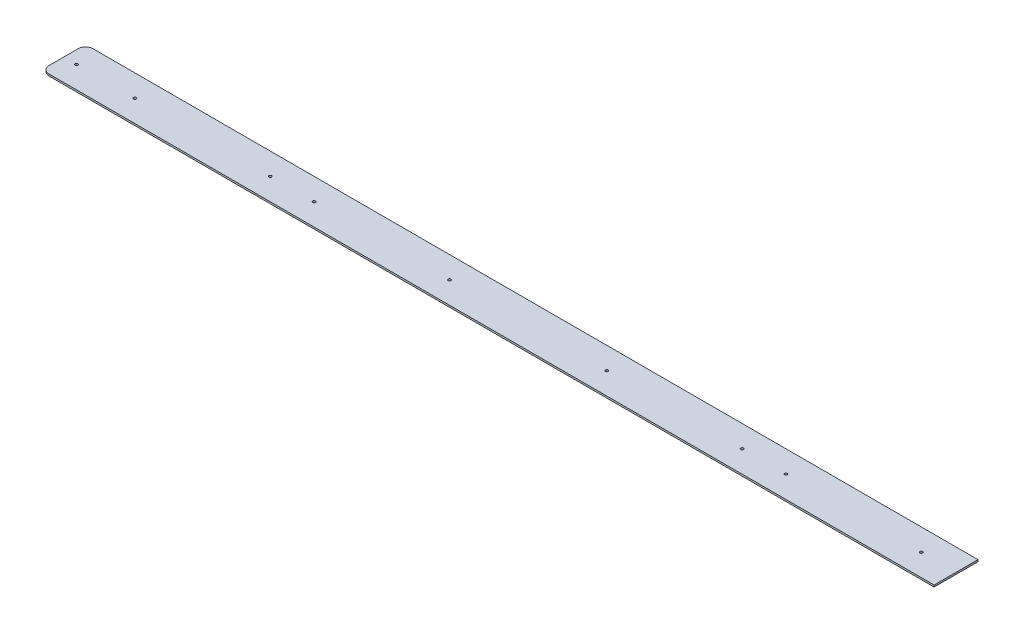
ISO-10303-21;
HEADER;
FILE_DESCRIPTION(('STEP AP214'),'2;1');
FILE_NAME('part.step','',(''),(''),'','','');
FILE_SCHEMA(('AUTOMOTIVE_DESIGN { 1 0 10303 214 1 1 1 1 }'));
ENDSEC;
DATA;
#1=APPLICATION_CONTEXT('core data for automotive mechanical design processes');
#2=APPLICATION_PROTOCOL_DEFINITION('international standard','automotive_design',2000,#1);
#3=PRODUCT_CONTEXT('',#1,'mechanical');
#4=PRODUCT('Part','Part','',(#3));
#5=PRODUCT_RELATED_PRODUCT_CATEGORY('part','',(#4));
#6=PRODUCT_DEFINITION_FORMATION('','',#4);
#7=PRODUCT_DEFINITION_CONTEXT('part definition',#1,'design');
#8=PRODUCT_DEFINITION('design','',#6,#7);
#9=PRODUCT_DEFINITION_SHAPE('','',#8);
#10=(LENGTH_UNIT() NAMED_UNIT(*) SI_UNIT(.MILLI.,.METRE.));
#11=(NAMED_UNIT(*) PLANE_ANGLE_UNIT() SI_UNIT($,.RADIAN.));
#12=(NAMED_UNIT(*) SI_UNIT($,.STERADIAN.) SOLID_ANGLE_UNIT());
#13=UNCERTAINTY_MEASURE_WITH_UNIT(LENGTH_MEASURE(1.E-05),#10,'distance_accuracy_value','');
#14=(GEOMETRIC_REPRESENTATION_CONTEXT(3) GLOBAL_UNCERTAINTY_ASSIGNED_CONTEXT((#13)) GLOBAL_UNIT_ASSIGNED_CONTEXT((#10,
#11,#12)) REPRESENTATION_CONTEXT('',''));
#15=CARTESIAN_POINT('',(0.,0.,0.));
#16=DIRECTION('',(0.,0.,1.));
#17=DIRECTION('',(1.,0.,0.));
#18=AXIS2_PLACEMENT_3D('',#15,#16,#17);
#19=CARTESIAN_POINT('',(-1536.7,-3.17499999999998,38.1000000000001));
#20=DIRECTION('',(0.,0.,1.));
#21=DIRECTION('',(1.,0.,0.));
#22=AXIS2_PLACEMENT_3D('',#19,#20,#21);
#23=PLANE('',#22);
#24=DIRECTION('',(1.,0.,0.));
#25=VECTOR('',#24,1.);
#26=CARTESIAN_POINT('',(-1536.7,0.,38.1000000000002));
#27=LINE('',#26,#25);
#28=CARTESIAN_POINT('',(-1536.7,0.,38.1000000000001));
#29=VERTEX_POINT('',#28);
#30=CARTESIAN_POINT('',(1.11022302462516E-13,0.,38.1));
#31=VERTEX_POINT('',#30);
#32=EDGE_CURVE('E84',#29,#31,#27,.T.);
#33=ORIENTED_EDGE('',*,*,#32,.F.);
#34=DIRECTION('',(0.,1.,0.));
#35=VECTOR('',#34,1.);
#36=CARTESIAN_POINT('',(-1536.7,-3.17499999999998,38.1));
#37=LINE('',#36,#35);
#38=CARTESIAN_POINT('',(-1536.7,-3.17499999999998,38.1));
#39=VERTEX_POINT('',#38);
#40=EDGE_CURVE('E11',#39,#29,#37,.T.);
#41=ORIENTED_EDGE('',*,*,#40,.F.);
#42=DIRECTION('',(1.,0.,0.));
#43=VECTOR('',#42,1.);
#44=CARTESIAN_POINT('',(-1536.7,-3.17499999999998,38.1000000000001));
#45=LINE('',#44,#43);
#46=CARTESIAN_POINT('',(1.11022302462516E-13,-3.175,38.1));
#47=VERTEX_POINT('',#46);
#48=EDGE_CURVE('E86',#39,#47,#45,.T.);
#49=ORIENTED_EDGE('',*,*,#48,.T.);
#50=DIRECTION('',(0.,1.,0.));
#51=VECTOR('',#50,1.);
#52=CARTESIAN_POINT('',(1.11022302462516E-13,-3.175,38.1));
#53=LINE('',#52,#51);
#54=EDGE_CURVE('E35',#47,#31,#53,.T.);
#55=ORIENTED_EDGE('',*,*,#54,.T.);
#56=EDGE_LOOP('',(#33,#41,#49,#55));
#57=FACE_BOUND('',#56,.T.);
#58=ADVANCED_FACE('F32',(#57),#23,.T.);
#59=CARTESIAN_POINT('',(-1536.7,-3.17499999999998,25.4000000000002));
#60=DIRECTION('',(0.,1.,0.));
#61=DIRECTION('',(0.,0.,1.));
#62=AXIS2_PLACEMENT_3D('',#59,#60,#61);
#63=CYLINDRICAL_SURFACE('',#62,12.7);
#64=CARTESIAN_POINT('',(-1536.7,0.,25.4000000000002));
#65=DIRECTION('',(0.,1.,0.));
#66=DIRECTION('',(0.,0.,1.));
#67=AXIS2_PLACEMENT_3D('',#64,#65,#66);
#68=CIRCLE('',#67,12.7);
#69=CARTESIAN_POINT('',(-1549.4,0.,25.4000000000001));
#70=VERTEX_POINT('',#69);
#71=EDGE_CURVE('E102',#70,#29,#68,.T.);
#72=ORIENTED_EDGE('',*,*,#71,.F.);
#73=DIRECTION('',(0.,1.,0.));
#74=VECTOR('',#73,1.);
#75=CARTESIAN_POINT('',(-1549.4,-3.17499999999996,25.4000000000002));
#76=LINE('',#75,#74);
#77=CARTESIAN_POINT('',(-1549.4,-3.17499999999996,25.4000000000002));
#78=VERTEX_POINT('',#77);
#79=EDGE_CURVE('E40',#78,#70,#76,.T.);
#80=ORIENTED_EDGE('',*,*,#79,.F.);
#81=CARTESIAN_POINT('',(-1536.7,-3.17499999999998,25.4000000000002));
#82=DIRECTION('',(0.,1.,0.));
#83=DIRECTION('',(0.,0.,1.));
#84=AXIS2_PLACEMENT_3D('',#81,#82,#83);
#85=CIRCLE('',#84,12.7);
#86=EDGE_CURVE('E91',#78,#39,#85,.T.);
#87=ORIENTED_EDGE('',*,*,#86,.T.);
#88=ORIENTED_EDGE('',*,*,#40,.T.);
#89=EDGE_LOOP('',(#72,#80,#87,#88));
#90=FACE_BOUND('',#89,.T.);
#91=ADVANCED_FACE('F142',(#90),#63,.T.);
#92=CARTESIAN_POINT('',(-1549.4,-3.17499999999996,-25.4000000000001));
#93=DIRECTION('',(-1.,0.,0.));
#94=DIRECTION('',(0.,0.,1.));
#95=AXIS2_PLACEMENT_3D('',#92,#93,#94);
#96=PLANE('',#95);
#97=DIRECTION('',(0.,0.,1.));
#98=VECTOR('',#97,1.);
#99=CARTESIAN_POINT('',(-1549.4,0.,-25.4000000000002));
#100=LINE('',#99,#98);
#101=CARTESIAN_POINT('',(-1549.4,0.,-25.4000000000002));
#102=VERTEX_POINT('',#101);
#103=EDGE_CURVE('E114',#102,#70,#100,.T.);
#104=ORIENTED_EDGE('',*,*,#103,.F.);
#105=DIRECTION('',(0.,1.,0.));
#106=VECTOR('',#105,1.);
#107=CARTESIAN_POINT('',(-1549.4,-3.17499999999996,-25.4000000000001));
#108=LINE('',#107,#106);
#109=CARTESIAN_POINT('',(-1549.4,-3.17499999999996,-25.4000000000001));
#110=VERTEX_POINT('',#109);
#111=EDGE_CURVE('E130',#110,#102,#108,.T.);
#112=ORIENTED_EDGE('',*,*,#111,.F.);
#113=DIRECTION('',(0.,0.,1.));
#114=VECTOR('',#113,1.);
#115=CARTESIAN_POINT('',(-1549.4,-3.17499999999996,-25.4000000000001));
#116=LINE('',#115,#114);
#117=EDGE_CURVE('E126',#110,#78,#116,.T.);
#118=ORIENTED_EDGE('',*,*,#117,.T.);
#119=ORIENTED_EDGE('',*,*,#79,.T.);
#120=EDGE_LOOP('',(#104,#112,#118,#119));
#121=FACE_BOUND('',#120,.T.);
#122=ADVANCED_FACE('F147',(#121),#96,.T.);
#123=CARTESIAN_POINT('',(-1536.7,-3.17499999999996,-25.4000000000002));
#124=DIRECTION('',(0.,1.,0.));
#125=DIRECTION('',(0.,0.,1.));
#126=AXIS2_PLACEMENT_3D('',#123,#124,#125);
#127=CYLINDRICAL_SURFACE('',#126,12.7);
#128=CARTESIAN_POINT('',(-1536.7,0.,-25.4000000000002));
#129=DIRECTION('',(0.,1.,0.));
#130=DIRECTION('',(0.,0.,1.));
#131=AXIS2_PLACEMENT_3D('',#128,#129,#130);
#132=CIRCLE('',#131,12.7);
#133=CARTESIAN_POINT('',(-1536.7,0.,-38.1000000000001));
#134=VERTEX_POINT('',#133);
#135=EDGE_CURVE('E111',#134,#102,#132,.T.);
#136=ORIENTED_EDGE('',*,*,#135,.F.);
#137=DIRECTION('',(0.,1.,0.));
#138=VECTOR('',#137,1.);
#139=CARTESIAN_POINT('',(-1536.7,-3.17499999999996,-38.1000000000002));
#140=LINE('',#139,#138);
#141=CARTESIAN_POINT('',(-1536.7,-3.17499999999996,-38.1000000000002));
#142=VERTEX_POINT('',#141);
#143=EDGE_CURVE('E132',#142,#134,#140,.T.);
#144=ORIENTED_EDGE('',*,*,#143,.F.);
#145=CARTESIAN_POINT('',(-1536.7,-3.17499999999996,-25.4000000000002));
#146=DIRECTION('',(0.,1.,0.));
#147=DIRECTION('',(0.,0.,1.));
#148=AXIS2_PLACEMENT_3D('',#145,#146,#147);
#149=CIRCLE('',#148,12.7);
#150=EDGE_CURVE('E123',#142,#110,#149,.T.);
#151=ORIENTED_EDGE('',*,*,#150,.T.);
#152=ORIENTED_EDGE('',*,*,#111,.T.);
#153=EDGE_LOOP('',(#136,#144,#151,#152));
#154=FACE_BOUND('',#153,.T.);
#155=ADVANCED_FACE('F139',(#154),#127,.T.);
#156=CARTESIAN_POINT('',(1.11022302462516E-13,-3.17500000000001,-38.0999999999999));
#157=DIRECTION('',(0.,0.,-1.));
#158=DIRECTION('',(-1.,0.,0.));
#159=AXIS2_PLACEMENT_3D('',#156,#157,#158);
#160=PLANE('',#159);
#161=DIRECTION('',(-1.,0.,0.));
#162=VECTOR('',#161,1.);
#163=CARTESIAN_POINT('',(1.11022302462516E-13,0.,-38.1000000000001));
#164=LINE('',#163,#162);
#165=CARTESIAN_POINT('',(1.11022302462516E-13,0.,-38.1000000000001));
#166=VERTEX_POINT('',#165);
#167=EDGE_CURVE('E98',#166,#134,#164,.T.);
#168=ORIENTED_EDGE('',*,*,#167,.F.);
#169=DIRECTION('',(0.,1.,0.));
#170=VECTOR('',#169,1.);
#171=CARTESIAN_POINT('',(1.11022302462516E-13,-3.17500000000001,-38.0999999999999));
#172=LINE('',#171,#170);
#173=CARTESIAN_POINT('',(1.11022302462516E-13,-3.17500000000001,-38.0999999999999));
#174=VERTEX_POINT('',#173);
#175=EDGE_CURVE('E90',#174,#166,#172,.T.);
#176=ORIENTED_EDGE('',*,*,#175,.F.);
#177=DIRECTION('',(-1.,0.,0.));
#178=VECTOR('',#177,1.);
#179=CARTESIAN_POINT('',(1.11022302462516E-13,-3.17500000000001,-38.0999999999999));
#180=LINE('',#179,#178);
#181=EDGE_CURVE('E120',#174,#142,#180,.T.);
#182=ORIENTED_EDGE('',*,*,#181,.T.);
#183=ORIENTED_EDGE('',*,*,#143,.T.);
#184=EDGE_LOOP('',(#168,#176,#182,#183));
#185=FACE_BOUND('',#184,.T.);
#186=ADVANCED_FACE('F135',(#185),#160,.T.);
#187=CARTESIAN_POINT('',(1.11022302462516E-13,-3.175,38.1));
#188=DIRECTION('',(1.,0.,0.));
#189=DIRECTION('',(0.,0.,-1.));
#190=AXIS2_PLACEMENT_3D('',#187,#188,#189);
#191=PLANE('',#190);
#192=DIRECTION('',(0.,0.,-1.));
#193=VECTOR('',#192,1.);
#194=CARTESIAN_POINT('',(1.11022302462516E-13,0.,38.1));
#195=LINE('',#194,#193);
#196=EDGE_CURVE('E93',#31,#166,#195,.T.);
#197=ORIENTED_EDGE('',*,*,#196,.F.);
#198=ORIENTED_EDGE('',*,*,#54,.F.);
#199=DIRECTION('',(0.,0.,-1.));
#200=VECTOR('',#199,1.);
#201=CARTESIAN_POINT('',(1.11022302462516E-13,-3.175,38.1));
#202=LINE('',#201,#200);
#203=EDGE_CURVE('E118',#47,#174,#202,.T.);
#204=ORIENTED_EDGE('',*,*,#203,.T.);
#205=ORIENTED_EDGE('',*,*,#175,.T.);
#206=EDGE_LOOP('',(#197,#198,#204,#205));
#207=FACE_BOUND('',#206,.T.);
#208=ADVANCED_FACE('F94',(#207),#191,.T.);
#209=CARTESIAN_POINT('',(-1536.7,-3.17499999999996,-25.4000000000002));
#210=DIRECTION('',(0.,1.,0.));
#211=DIRECTION('',(0.,0.,1.));
#212=AXIS2_PLACEMENT_3D('',#209,#210,#211);
#213=PLANE('',#212);
#214=CARTESIAN_POINT('',(-1527.175,-3.17499999999998,-1.11022302462516E-13));
#215=DIRECTION('',(0.,1.,0.));
#216=DIRECTION('',(0.,0.,1.));
#217=AXIS2_PLACEMENT_3D('',#214,#215,#216);
#218=CIRCLE('',#217,2.38759999999994);
#219=CARTESIAN_POINT('',(-1527.175,-3.17499999999998,2.38759999999983));
#220=VERTEX_POINT('',#219);
#221=EDGE_CURVE('E303',#220,#220,#218,.T.);
#222=ORIENTED_EDGE('',*,*,#221,.T.);
#223=EDGE_LOOP('',(#222));
#224=FACE_BOUND('',#223,.T.);
#225=CARTESIAN_POINT('',(-1425.575,-3.17499999999996,0.));
#226=DIRECTION('',(0.,1.,0.));
#227=DIRECTION('',(0.,0.,1.));
#228=AXIS2_PLACEMENT_3D('',#225,#226,#227);
#229=CIRCLE('',#228,2.38759999999994);
#230=CARTESIAN_POINT('',(-1425.575,-3.17499999999996,2.38759999999994));
#231=VERTEX_POINT('',#230);
#232=EDGE_CURVE('E313',#231,#231,#229,.T.);
#233=ORIENTED_EDGE('',*,*,#232,.T.);
#234=EDGE_LOOP('',(#233));
#235=FACE_BOUND('',#234,.T.);
#236=CARTESIAN_POINT('',(-1190.625,-3.17499999999996,0.));
#237=DIRECTION('',(0.,1.,0.));
#238=DIRECTION('',(0.,0.,1.));
#239=AXIS2_PLACEMENT_3D('',#236,#237,#238);
#240=CIRCLE('',#239,2.38759999999994);
#241=CARTESIAN_POINT('',(-1190.625,-3.17499999999996,2.38759999999994));
#242=VERTEX_POINT('',#241);
#243=EDGE_CURVE('E319',#242,#242,#240,.T.);
#244=ORIENTED_EDGE('',*,*,#243,.T.);
#245=EDGE_LOOP('',(#244));
#246=FACE_BOUND('',#245,.T.);
#247=CARTESIAN_POINT('',(-1114.425,-3.17499999999996,0.));
#248=DIRECTION('',(0.,1.,0.));
#249=DIRECTION('',(0.,0.,1.));
#250=AXIS2_PLACEMENT_3D('',#247,#248,#249);
#251=CIRCLE('',#250,2.38759999999994);
#252=CARTESIAN_POINT('',(-1114.425,-3.17499999999996,2.38759999999994));
#253=VERTEX_POINT('',#252);
#254=EDGE_CURVE('E325',#253,#253,#251,.T.);
#255=ORIENTED_EDGE('',*,*,#254,.T.);
#256=EDGE_LOOP('',(#255));
#257=FACE_BOUND('',#256,.T.);
#258=CARTESIAN_POINT('',(-879.475,-3.17500000000001,-1.11022302462516E-13));
#259=DIRECTION('',(0.,1.,0.));
#260=DIRECTION('',(0.,0.,1.));
#261=AXIS2_PLACEMENT_3D('',#258,#259,#260);
#262=CIRCLE('',#261,2.38760000000005);
#263=CARTESIAN_POINT('',(-879.475,-3.17500000000001,2.38759999999994));
#264=VERTEX_POINT('',#263);
#265=EDGE_CURVE('E331',#264,#264,#262,.T.);
#266=ORIENTED_EDGE('',*,*,#265,.T.);
#267=EDGE_LOOP('',(#266));
#268=FACE_BOUND('',#267,.T.);
#269=CARTESIAN_POINT('',(-606.425,-3.17500000000001,0.));
#270=DIRECTION('',(0.,1.,0.));
#271=DIRECTION('',(0.,0.,1.));
#272=AXIS2_PLACEMENT_3D('',#269,#270,#271);
#273=CIRCLE('',#272,2.38760000000005);
#274=CARTESIAN_POINT('',(-606.425,-3.17500000000001,2.38760000000005));
#275=VERTEX_POINT('',#274);
#276=EDGE_CURVE('E337',#275,#275,#273,.T.);
#277=ORIENTED_EDGE('',*,*,#276,.T.);
#278=EDGE_LOOP('',(#277));
#279=FACE_BOUND('',#278,.T.);
#280=CARTESIAN_POINT('',(-371.475,-3.17500000000001,-1.11022302462516E-13));
#281=DIRECTION('',(0.,1.,0.));
#282=DIRECTION('',(0.,0.,1.));
#283=AXIS2_PLACEMENT_3D('',#280,#281,#282);
#284=CIRCLE('',#283,2.38759999999999);
#285=CARTESIAN_POINT('',(-371.475,-3.17500000000001,2.38759999999988));
#286=VERTEX_POINT('',#285);
#287=EDGE_CURVE('E343',#286,#286,#284,.T.);
#288=ORIENTED_EDGE('',*,*,#287,.T.);
#289=EDGE_LOOP('',(#288));
#290=FACE_BOUND('',#289,.T.);
#291=CARTESIAN_POINT('',(-295.275,-3.17500000000001,1.11022302462516E-13));
#292=DIRECTION('',(0.,1.,0.));
#293=DIRECTION('',(0.,0.,1.));
#294=AXIS2_PLACEMENT_3D('',#291,#292,#293);
#295=CIRCLE('',#294,2.38759999999999);
#296=CARTESIAN_POINT('',(-295.275,-3.17500000000001,2.3876000000001));
#297=VERTEX_POINT('',#296);
#298=EDGE_CURVE('E349',#297,#297,#295,.T.);
#299=ORIENTED_EDGE('',*,*,#298,.T.);
#300=EDGE_LOOP('',(#299));
#301=FACE_BOUND('',#300,.T.);
#302=CARTESIAN_POINT('',(-60.325,-3.17500000000001,0.));
#303=DIRECTION('',(0.,1.,0.));
#304=DIRECTION('',(0.,0.,1.));
#305=AXIS2_PLACEMENT_3D('',#302,#303,#304);
#306=CIRCLE('',#305,2.38760000000001);
#307=CARTESIAN_POINT('',(-60.325,-3.17500000000001,2.38760000000001));
#308=VERTEX_POINT('',#307);
#309=EDGE_CURVE('E103',#308,#308,#306,.T.);
#310=ORIENTED_EDGE('',*,*,#309,.T.);
#311=EDGE_LOOP('',(#310));
#312=FACE_BOUND('',#311,.T.);
#313=ORIENTED_EDGE('',*,*,#48,.F.);
#314=ORIENTED_EDGE('',*,*,#86,.F.);
#315=ORIENTED_EDGE('',*,*,#117,.F.);
#316=ORIENTED_EDGE('',*,*,#150,.F.);
#317=ORIENTED_EDGE('',*,*,#181,.F.);
#318=ORIENTED_EDGE('',*,*,#203,.F.);
#319=EDGE_LOOP('',(#313,#314,#315,#316,#317,#318));
#320=FACE_BOUND('',#319,.T.);
#321=ADVANCED_FACE('F146',(#224,#235,#246,#257,#268,#279,#290,#301,#312,#320),#213,.F.);
#322=CARTESIAN_POINT('',(-1536.7,0.,-25.4000000000002));
#323=DIRECTION('',(0.,1.,0.));
#324=DIRECTION('',(0.,0.,1.));
#325=AXIS2_PLACEMENT_3D('',#322,#323,#324);
#326=PLANE('',#325);
#327=CARTESIAN_POINT('',(-1527.175,0.,-2.22044604925031E-13));
#328=DIRECTION('',(0.,1.,0.));
#329=DIRECTION('',(0.,0.,1.));
#330=AXIS2_PLACEMENT_3D('',#327,#328,#329);
#331=CIRCLE('',#330,2.38759999999994);
#332=CARTESIAN_POINT('',(-1527.175,0.,2.38759999999972));
#333=VERTEX_POINT('',#332);
#334=EDGE_CURVE('E306',#333,#333,#331,.T.);
#335=ORIENTED_EDGE('',*,*,#334,.F.);
#336=EDGE_LOOP('',(#335));
#337=FACE_BOUND('',#336,.T.);
#338=CARTESIAN_POINT('',(-1425.575,0.,0.));
#339=DIRECTION('',(0.,1.,0.));
#340=DIRECTION('',(0.,0.,1.));
#341=AXIS2_PLACEMENT_3D('',#338,#339,#340);
#342=CIRCLE('',#341,2.38759999999994);
#343=CARTESIAN_POINT('',(-1425.575,0.,2.38759999999994));
#344=VERTEX_POINT('',#343);
#345=EDGE_CURVE('E308',#344,#344,#342,.T.);
#346=ORIENTED_EDGE('',*,*,#345,.F.);
#347=EDGE_LOOP('',(#346));
#348=FACE_BOUND('',#347,.T.);
#349=CARTESIAN_POINT('',(-1190.625,0.,0.));
#350=DIRECTION('',(0.,1.,0.));
#351=DIRECTION('',(0.,0.,1.));
#352=AXIS2_PLACEMENT_3D('',#349,#350,#351);
#353=CIRCLE('',#352,2.38759999999994);
#354=CARTESIAN_POINT('',(-1190.625,0.,2.38759999999994));
#355=VERTEX_POINT('',#354);
#356=EDGE_CURVE('E316',#355,#355,#353,.T.);
#357=ORIENTED_EDGE('',*,*,#356,.F.);
#358=EDGE_LOOP('',(#357));
#359=FACE_BOUND('',#358,.T.);
#360=CARTESIAN_POINT('',(-1114.425,0.,0.));
#361=DIRECTION('',(0.,1.,0.));
#362=DIRECTION('',(0.,0.,1.));
#363=AXIS2_PLACEMENT_3D('',#360,#361,#362);
#364=CIRCLE('',#363,2.38759999999994);
#365=CARTESIAN_POINT('',(-1114.425,0.,2.38759999999994));
#366=VERTEX_POINT('',#365);
#367=EDGE_CURVE('E322',#366,#366,#364,.T.);
#368=ORIENTED_EDGE('',*,*,#367,.F.);
#369=EDGE_LOOP('',(#368));
#370=FACE_BOUND('',#369,.T.);
#371=CARTESIAN_POINT('',(-879.475,0.,0.));
#372=DIRECTION('',(0.,1.,0.));
#373=DIRECTION('',(0.,0.,1.));
#374=AXIS2_PLACEMENT_3D('',#371,#372,#373);
#375=CIRCLE('',#374,2.38760000000005);
#376=CARTESIAN_POINT('',(-879.475,0.,2.38760000000005));
#377=VERTEX_POINT('',#376);
#378=EDGE_CURVE('E328',#377,#377,#375,.T.);
#379=ORIENTED_EDGE('',*,*,#378,.F.);
#380=EDGE_LOOP('',(#379));
#381=FACE_BOUND('',#380,.T.);
#382=CARTESIAN_POINT('',(-606.425,0.,0.));
#383=DIRECTION('',(0.,1.,0.));
#384=DIRECTION('',(0.,0.,1.));
#385=AXIS2_PLACEMENT_3D('',#382,#383,#384);
#386=CIRCLE('',#385,2.38760000000005);
#387=CARTESIAN_POINT('',(-606.425,0.,2.38760000000005));
#388=VERTEX_POINT('',#387);
#389=EDGE_CURVE('E334',#388,#388,#386,.T.);
#390=ORIENTED_EDGE('',*,*,#389,.F.);
#391=EDGE_LOOP('',(#390));
#392=FACE_BOUND('',#391,.T.);
#393=CARTESIAN_POINT('',(-371.475,0.,0.));
#394=DIRECTION('',(0.,1.,0.));
#395=DIRECTION('',(0.,0.,1.));
#396=AXIS2_PLACEMENT_3D('',#393,#394,#395);
#397=CIRCLE('',#396,2.38759999999999);
#398=CARTESIAN_POINT('',(-371.475,0.,2.38759999999999));
#399=VERTEX_POINT('',#398);
#400=EDGE_CURVE('E340',#399,#399,#397,.T.);
#401=ORIENTED_EDGE('',*,*,#400,.F.);
#402=EDGE_LOOP('',(#401));
#403=FACE_BOUND('',#402,.T.);
#404=CARTESIAN_POINT('',(-295.275,0.,0.));
#405=DIRECTION('',(0.,1.,0.));
#406=DIRECTION('',(0.,0.,1.));
#407=AXIS2_PLACEMENT_3D('',#404,#405,#406);
#408=CIRCLE('',#407,2.38759999999999);
#409=CARTESIAN_POINT('',(-295.275,0.,2.38759999999999));
#410=VERTEX_POINT('',#409);
#411=EDGE_CURVE('E346',#410,#410,#408,.T.);
#412=ORIENTED_EDGE('',*,*,#411,.F.);
#413=EDGE_LOOP('',(#412));
#414=FACE_BOUND('',#413,.T.);
#415=CARTESIAN_POINT('',(-60.325,0.,0.));
#416=DIRECTION('',(0.,1.,0.));
#417=DIRECTION('',(0.,0.,1.));
#418=AXIS2_PLACEMENT_3D('',#415,#416,#417);
#419=CIRCLE('',#418,2.38760000000001);
#420=CARTESIAN_POINT('',(-60.325,0.,2.38760000000001));
#421=VERTEX_POINT('',#420);
#422=EDGE_CURVE('E106',#421,#421,#419,.T.);
#423=ORIENTED_EDGE('',*,*,#422,.F.);
#424=EDGE_LOOP('',(#423));
#425=FACE_BOUND('',#424,.T.);
#426=ORIENTED_EDGE('',*,*,#32,.T.);
#427=ORIENTED_EDGE('',*,*,#196,.T.);
#428=ORIENTED_EDGE('',*,*,#167,.T.);
#429=ORIENTED_EDGE('',*,*,#135,.T.);
#430=ORIENTED_EDGE('',*,*,#103,.T.);
#431=ORIENTED_EDGE('',*,*,#71,.T.);
#432=EDGE_LOOP('',(#426,#427,#428,#429,#430,#431));
#433=FACE_BOUND('',#432,.T.);
#434=ADVANCED_FACE('F100',(#337,#348,#359,#370,#381,#392,#403,#414,#425,#433),#326,.T.);
#435=CARTESIAN_POINT('',(-60.325,-3.17500000000001,0.));
#436=DIRECTION('',(0.,1.,0.));
#437=DIRECTION('',(0.,0.,1.));
#438=AXIS2_PLACEMENT_3D('',#435,#436,#437);
#439=CYLINDRICAL_SURFACE('',#438,2.38760000000001);
#440=ORIENTED_EDGE('',*,*,#309,.F.);
#441=EDGE_LOOP('',(#440));
#442=FACE_BOUND('',#441,.T.);
#443=ORIENTED_EDGE('',*,*,#422,.T.);
#444=EDGE_LOOP('',(#443));
#445=FACE_BOUND('',#444,.T.);
#446=ADVANCED_FACE('F206',(#442,#445),#439,.F.);
#447=CARTESIAN_POINT('',(-295.275,-3.17500000000001,1.11022302462516E-13));
#448=DIRECTION('',(0.,1.,0.));
#449=DIRECTION('',(0.,0.,1.));
#450=AXIS2_PLACEMENT_3D('',#447,#448,#449);
#451=CYLINDRICAL_SURFACE('',#450,2.38759999999999);
#452=ORIENTED_EDGE('',*,*,#298,.F.);
#453=EDGE_LOOP('',(#452));
#454=FACE_BOUND('',#453,.T.);
#455=ORIENTED_EDGE('',*,*,#411,.T.);
#456=EDGE_LOOP('',(#455));
#457=FACE_BOUND('',#456,.T.);
#458=ADVANCED_FACE('F216',(#454,#457),#451,.F.);
#459=CARTESIAN_POINT('',(-371.475,-3.17500000000001,-1.11022302462516E-13));
#460=DIRECTION('',(0.,1.,0.));
#461=DIRECTION('',(0.,0.,1.));
#462=AXIS2_PLACEMENT_3D('',#459,#460,#461);
#463=CYLINDRICAL_SURFACE('',#462,2.38759999999999);
#464=ORIENTED_EDGE('',*,*,#287,.F.);
#465=EDGE_LOOP('',(#464));
#466=FACE_BOUND('',#465,.T.);
#467=ORIENTED_EDGE('',*,*,#400,.T.);
#468=EDGE_LOOP('',(#467));
#469=FACE_BOUND('',#468,.T.);
#470=ADVANCED_FACE('F226',(#466,#469),#463,.F.);
#471=CARTESIAN_POINT('',(-606.425,-3.17500000000001,0.));
#472=DIRECTION('',(0.,1.,0.));
#473=DIRECTION('',(0.,0.,1.));
#474=AXIS2_PLACEMENT_3D('',#471,#472,#473);
#475=CYLINDRICAL_SURFACE('',#474,2.38760000000005);
#476=ORIENTED_EDGE('',*,*,#276,.F.);
#477=EDGE_LOOP('',(#476));
#478=FACE_BOUND('',#477,.T.);
#479=ORIENTED_EDGE('',*,*,#389,.T.);
#480=EDGE_LOOP('',(#479));
#481=FACE_BOUND('',#480,.T.);
#482=ADVANCED_FACE('F236',(#478,#481),#475,.F.);
#483=CARTESIAN_POINT('',(-879.475,-3.17500000000001,-1.11022302462516E-13));
#484=DIRECTION('',(0.,1.,0.));
#485=DIRECTION('',(0.,0.,1.));
#486=AXIS2_PLACEMENT_3D('',#483,#484,#485);
#487=CYLINDRICAL_SURFACE('',#486,2.38760000000005);
#488=ORIENTED_EDGE('',*,*,#265,.F.);
#489=EDGE_LOOP('',(#488));
#490=FACE_BOUND('',#489,.T.);
#491=ORIENTED_EDGE('',*,*,#378,.T.);
#492=EDGE_LOOP('',(#491));
#493=FACE_BOUND('',#492,.T.);
#494=ADVANCED_FACE('F246',(#490,#493),#487,.F.);
#495=CARTESIAN_POINT('',(-1114.425,-3.17499999999996,0.));
#496=DIRECTION('',(0.,1.,0.));
#497=DIRECTION('',(0.,0.,1.));
#498=AXIS2_PLACEMENT_3D('',#495,#496,#497);
#499=CYLINDRICAL_SURFACE('',#498,2.38759999999994);
#500=ORIENTED_EDGE('',*,*,#254,.F.);
#501=EDGE_LOOP('',(#500));
#502=FACE_BOUND('',#501,.T.);
#503=ORIENTED_EDGE('',*,*,#367,.T.);
#504=EDGE_LOOP('',(#503));
#505=FACE_BOUND('',#504,.T.);
#506=ADVANCED_FACE('F256',(#502,#505),#499,.F.);
#507=CARTESIAN_POINT('',(-1190.625,-3.17499999999996,0.));
#508=DIRECTION('',(0.,1.,0.));
#509=DIRECTION('',(0.,0.,1.));
#510=AXIS2_PLACEMENT_3D('',#507,#508,#509);
#511=CYLINDRICAL_SURFACE('',#510,2.38759999999994);
#512=ORIENTED_EDGE('',*,*,#243,.F.);
#513=EDGE_LOOP('',(#512));
#514=FACE_BOUND('',#513,.T.);
#515=ORIENTED_EDGE('',*,*,#356,.T.);
#516=EDGE_LOOP('',(#515));
#517=FACE_BOUND('',#516,.T.);
#518=ADVANCED_FACE('F266',(#514,#517),#511,.F.);
#519=CARTESIAN_POINT('',(-1425.575,-3.17499999999996,0.));
#520=DIRECTION('',(0.,1.,0.));
#521=DIRECTION('',(0.,0.,1.));
#522=AXIS2_PLACEMENT_3D('',#519,#520,#521);
#523=CYLINDRICAL_SURFACE('',#522,2.38759999999994);
#524=ORIENTED_EDGE('',*,*,#232,.F.);
#525=EDGE_LOOP('',(#524));
#526=FACE_BOUND('',#525,.T.);
#527=ORIENTED_EDGE('',*,*,#345,.T.);
#528=EDGE_LOOP('',(#527));
#529=FACE_BOUND('',#528,.T.);
#530=ADVANCED_FACE('F276',(#526,#529),#523,.F.);
#531=CARTESIAN_POINT('',(-1527.175,-3.17499999999998,-1.11022302462516E-13));
#532=DIRECTION('',(0.,1.,0.));
#533=DIRECTION('',(0.,0.,1.));
#534=AXIS2_PLACEMENT_3D('',#531,#532,#533);
#535=CYLINDRICAL_SURFACE('',#534,2.38759999999994);
#536=ORIENTED_EDGE('',*,*,#221,.F.);
#537=EDGE_LOOP('',(#536));
#538=FACE_BOUND('',#537,.T.);
#539=ORIENTED_EDGE('',*,*,#334,.T.);
#540=EDGE_LOOP('',(#539));
#541=FACE_BOUND('',#540,.T.);
#542=ADVANCED_FACE('F286',(#538,#541),#535,.F.);
#543=CLOSED_SHELL('',(#58,#91,#122,#155,#186,#208,#321,#434,#446,#458,#470,#482,#494,#506,#518,
#530,#542));
#544=MANIFOLD_SOLID_BREP('B2',#543);
#545=ADVANCED_BREP_SHAPE_REPRESENTATION('',(#18,#544),#14);
#546=SHAPE_DEFINITION_REPRESENTATION(#9,#545);
ENDSEC;
END-ISO-10303-21;
